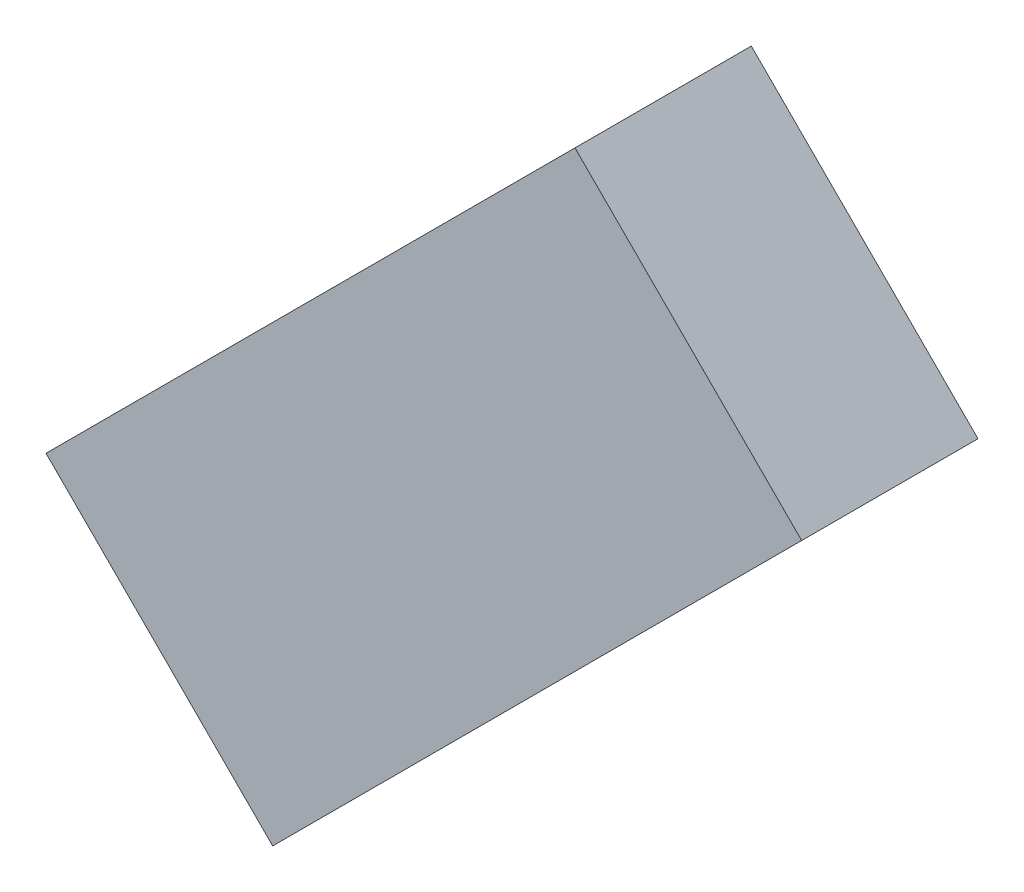
ISO-10303-21;
HEADER;
FILE_DESCRIPTION(('STEP AP214'),'2;1');
FILE_NAME('part.step','',(''),(''),'','','');
FILE_SCHEMA(('AUTOMOTIVE_DESIGN { 1 0 10303 214 1 1 1 1 }'));
ENDSEC;
DATA;
#1=APPLICATION_CONTEXT('core data for automotive mechanical design processes');
#2=APPLICATION_PROTOCOL_DEFINITION('international standard','automotive_design',2000,#1);
#3=PRODUCT_CONTEXT('',#1,'mechanical');
#4=PRODUCT('Part','Part','',(#3));
#5=PRODUCT_RELATED_PRODUCT_CATEGORY('part','',(#4));
#6=PRODUCT_DEFINITION_FORMATION('','',#4);
#7=PRODUCT_DEFINITION_CONTEXT('part definition',#1,'design');
#8=PRODUCT_DEFINITION('design','',#6,#7);
#9=PRODUCT_DEFINITION_SHAPE('','',#8);
#10=(LENGTH_UNIT() NAMED_UNIT(*) SI_UNIT(.MILLI.,.METRE.));
#11=(NAMED_UNIT(*) PLANE_ANGLE_UNIT() SI_UNIT($,.RADIAN.));
#12=(NAMED_UNIT(*) SI_UNIT($,.STERADIAN.) SOLID_ANGLE_UNIT());
#13=UNCERTAINTY_MEASURE_WITH_UNIT(LENGTH_MEASURE(1.E-05),#10,'distance_accuracy_value','');
#14=(GEOMETRIC_REPRESENTATION_CONTEXT(3) GLOBAL_UNCERTAINTY_ASSIGNED_CONTEXT((#13)) GLOBAL_UNIT_ASSIGNED_CONTEXT((#10,
#11,#12)) REPRESENTATION_CONTEXT('',''));
#15=CARTESIAN_POINT('',(0.,0.,0.));
#16=DIRECTION('',(0.,0.,1.));
#17=DIRECTION('',(1.,0.,0.));
#18=AXIS2_PLACEMENT_3D('',#15,#16,#17);
#19=CARTESIAN_POINT('',(-3.81,-1.52400254,1.778));
#20=DIRECTION('',(0.,0.,1.));
#21=DIRECTION('',(1.,0.,0.));
#22=AXIS2_PLACEMENT_3D('',#19,#20,#21);
#23=PLANE('',#22);
#24=DIRECTION('',(-0.707107174023939,0.707106388348938,0.));
#25=VECTOR('',#24,1.);
#26=CARTESIAN_POINT('',(1.524,3.81,1.778));
#27=LINE('',#26,#25);
#28=CARTESIAN_POINT('',(1.52400000000041,3.80999999999959,1.778));
#29=VERTEX_POINT('',#28);
#30=CARTESIAN_POINT('',(3.81000000000015,1.52400254000015,1.778));
#31=VERTEX_POINT('',#30);
#32=EDGE_CURVE('E53',#29,#31,#27,.F.);
#33=ORIENTED_EDGE('',*,*,#32,.F.);
#34=DIRECTION('',(-0.707106612828028,-0.707106949545028,0.));
#35=VECTOR('',#34,1.);
#36=CARTESIAN_POINT('',(-3.81,-1.52400254,1.778));
#37=LINE('',#36,#35);
#38=CARTESIAN_POINT('',(-3.81000000000029,-1.52400254000029,1.778));
#39=VERTEX_POINT('',#38);
#40=EDGE_CURVE('E68',#39,#29,#37,.F.);
#41=ORIENTED_EDGE('',*,*,#40,.F.);
#42=DIRECTION('',(0.707107174023939,-0.707106388348938,0.));
#43=VECTOR('',#42,1.);
#44=CARTESIAN_POINT('',(-1.524,-3.81,1.778));
#45=LINE('',#44,#43);
#46=CARTESIAN_POINT('',(-1.52400000000041,-3.80999999999959,1.778));
#47=VERTEX_POINT('',#46);
#48=EDGE_CURVE('E20',#47,#39,#45,.F.);
#49=ORIENTED_EDGE('',*,*,#48,.F.);
#50=DIRECTION('',(0.707106612828028,0.707106949545028,0.));
#51=VECTOR('',#50,1.);
#52=CARTESIAN_POINT('',(3.81,1.52400254,1.778));
#53=LINE('',#52,#51);
#54=EDGE_CURVE('E58',#31,#47,#53,.F.);
#55=ORIENTED_EDGE('',*,*,#54,.F.);
#56=EDGE_LOOP('',(#33,#41,#49,#55));
#57=FACE_BOUND('',#56,.T.);
#58=ADVANCED_FACE('F17',(#57),#23,.T.);
#59=CARTESIAN_POINT('',(-1.524,-3.81,0.));
#60=DIRECTION('',(-0.707106388348938,-0.707107174023939,0.));
#61=DIRECTION('',(0.707107174023939,-0.707106388348938,0.));
#62=AXIS2_PLACEMENT_3D('',#59,#60,#61);
#63=PLANE('',#62);
#64=DIRECTION('',(0.,0.,1.));
#65=VECTOR('',#64,1.);
#66=CARTESIAN_POINT('',(-3.81,-1.52400254,0.));
#67=LINE('',#66,#65);
#68=CARTESIAN_POINT('',(-3.81000000000029,-1.52400254000029,0.));
#69=VERTEX_POINT('',#68);
#70=EDGE_CURVE('E79',#69,#39,#67,.T.);
#71=ORIENTED_EDGE('',*,*,#70,.F.);
#72=DIRECTION('',(0.707107174023757,-0.70710638834912,0.));
#73=VECTOR('',#72,1.);
#74=CARTESIAN_POINT('',(-3.81,-1.52400254,0.));
#75=LINE('',#74,#73);
#76=CARTESIAN_POINT('',(-1.52400000000041,-3.80999999999959,0.));
#77=VERTEX_POINT('',#76);
#78=EDGE_CURVE('E74',#69,#77,#75,.T.);
#79=ORIENTED_EDGE('',*,*,#78,.T.);
#80=DIRECTION('',(0.,0.,1.));
#81=VECTOR('',#80,1.);
#82=CARTESIAN_POINT('',(-1.52400000000164,-3.80999999999836,0.));
#83=LINE('',#82,#81);
#84=EDGE_CURVE('E63',#47,#77,#83,.F.);
#85=ORIENTED_EDGE('',*,*,#84,.F.);
#86=ORIENTED_EDGE('',*,*,#48,.T.);
#87=EDGE_LOOP('',(#71,#79,#85,#86));
#88=FACE_BOUND('',#87,.T.);
#89=ADVANCED_FACE('F73',(#88),#63,.T.);
#90=CARTESIAN_POINT('',(3.81,1.52400254,0.));
#91=DIRECTION('',(0.707106949545028,-0.707106612828028,0.));
#92=DIRECTION('',(0.707106612828028,0.707106949545028,0.));
#93=AXIS2_PLACEMENT_3D('',#90,#91,#92);
#94=PLANE('',#93);
#95=ORIENTED_EDGE('',*,*,#84,.T.);
#96=DIRECTION('',(0.70710661282781,0.707106949545245,0.));
#97=VECTOR('',#96,1.);
#98=CARTESIAN_POINT('',(-1.524,-3.81,0.));
#99=LINE('',#98,#97);
#100=CARTESIAN_POINT('',(3.81000000000015,1.52400254000015,0.));
#101=VERTEX_POINT('',#100);
#102=EDGE_CURVE('E84',#77,#101,#99,.T.);
#103=ORIENTED_EDGE('',*,*,#102,.T.);
#104=DIRECTION('',(0.,0.,1.));
#105=VECTOR('',#104,1.);
#106=CARTESIAN_POINT('',(3.81000000000059,1.52400254000058,0.));
#107=LINE('',#106,#105);
#108=EDGE_CURVE('E65',#31,#101,#107,.F.);
#109=ORIENTED_EDGE('',*,*,#108,.F.);
#110=ORIENTED_EDGE('',*,*,#54,.T.);
#111=EDGE_LOOP('',(#95,#103,#109,#110));
#112=FACE_BOUND('',#111,.T.);
#113=ADVANCED_FACE('F60',(#112),#94,.T.);
#114=CARTESIAN_POINT('',(1.524,3.81,0.));
#115=DIRECTION('',(0.707106388348938,0.707107174023939,0.));
#116=DIRECTION('',(-0.707107174023939,0.707106388348938,0.));
#117=AXIS2_PLACEMENT_3D('',#114,#115,#116);
#118=PLANE('',#117);
#119=ORIENTED_EDGE('',*,*,#108,.T.);
#120=DIRECTION('',(-0.707107174023757,0.70710638834912,0.));
#121=VECTOR('',#120,1.);
#122=CARTESIAN_POINT('',(3.81,1.52400254,0.));
#123=LINE('',#122,#121);
#124=CARTESIAN_POINT('',(1.52400000000041,3.80999999999959,0.));
#125=VERTEX_POINT('',#124);
#126=EDGE_CURVE('E26',#101,#125,#123,.T.);
#127=ORIENTED_EDGE('',*,*,#126,.T.);
#128=DIRECTION('',(0.,0.,1.));
#129=VECTOR('',#128,1.);
#130=CARTESIAN_POINT('',(1.52400000000164,3.80999999999836,0.));
#131=LINE('',#130,#129);
#132=EDGE_CURVE('E34',#29,#125,#131,.F.);
#133=ORIENTED_EDGE('',*,*,#132,.F.);
#134=ORIENTED_EDGE('',*,*,#32,.T.);
#135=EDGE_LOOP('',(#119,#127,#133,#134));
#136=FACE_BOUND('',#135,.T.);
#137=ADVANCED_FACE('F88',(#136),#118,.T.);
#138=CARTESIAN_POINT('',(-3.81,-1.52400254,0.));
#139=DIRECTION('',(-0.707106949545028,0.707106612828028,0.));
#140=DIRECTION('',(-0.707106612828028,-0.707106949545028,0.));
#141=AXIS2_PLACEMENT_3D('',#138,#139,#140);
#142=PLANE('',#141);
#143=ORIENTED_EDGE('',*,*,#132,.T.);
#144=DIRECTION('',(-0.70710661282781,-0.707106949545245,0.));
#145=VECTOR('',#144,1.);
#146=CARTESIAN_POINT('',(1.524,3.81,0.));
#147=LINE('',#146,#145);
#148=EDGE_CURVE('E11',#125,#69,#147,.T.);
#149=ORIENTED_EDGE('',*,*,#148,.T.);
#150=ORIENTED_EDGE('',*,*,#70,.T.);
#151=ORIENTED_EDGE('',*,*,#40,.T.);
#152=EDGE_LOOP('',(#143,#149,#150,#151));
#153=FACE_BOUND('',#152,.T.);
#154=ADVANCED_FACE('F91',(#153),#142,.T.);
#155=CARTESIAN_POINT('',(-3.81,-1.52400254,0.));
#156=DIRECTION('',(0.,0.,1.));
#157=DIRECTION('',(1.,0.,0.));
#158=AXIS2_PLACEMENT_3D('',#155,#156,#157);
#159=PLANE('',#158);
#160=ORIENTED_EDGE('',*,*,#126,.F.);
#161=ORIENTED_EDGE('',*,*,#102,.F.);
#162=ORIENTED_EDGE('',*,*,#78,.F.);
#163=ORIENTED_EDGE('',*,*,#148,.F.);
#164=EDGE_LOOP('',(#160,#161,#162,#163));
#165=FACE_BOUND('',#164,.T.);
#166=ADVANCED_FACE('F90',(#165),#159,.F.);
#167=CLOSED_SHELL('',(#58,#89,#113,#137,#154,#166));
#168=MANIFOLD_SOLID_BREP('B1',#167);
#169=ADVANCED_BREP_SHAPE_REPRESENTATION('',(#18,#168),#14);
#170=SHAPE_DEFINITION_REPRESENTATION(#9,#169);
ENDSEC;
END-ISO-10303-21;
